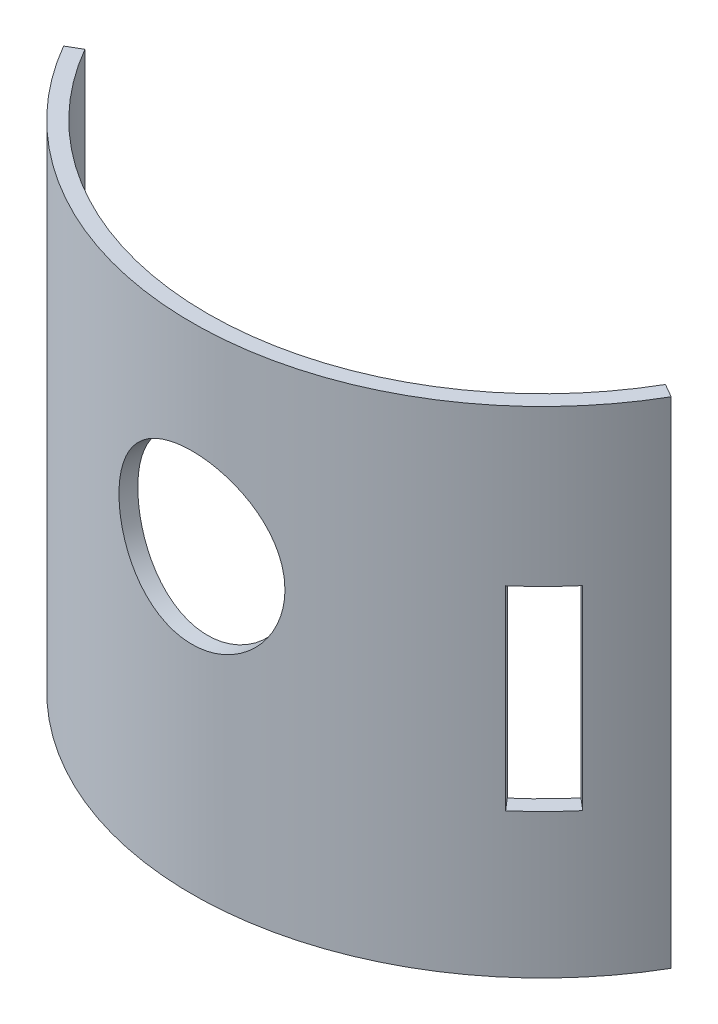
ISO-10303-21;
HEADER;
FILE_DESCRIPTION(('STEP AP214'),'2;1');
FILE_NAME('part.step','',(''),(''),'','','');
FILE_SCHEMA(('AUTOMOTIVE_DESIGN { 1 0 10303 214 1 1 1 1 }'));
ENDSEC;
DATA;
#1=APPLICATION_CONTEXT('core data for automotive mechanical design processes');
#2=APPLICATION_PROTOCOL_DEFINITION('international standard','automotive_design',2000,#1);
#3=PRODUCT_CONTEXT('',#1,'mechanical');
#4=PRODUCT('Part','Part','',(#3));
#5=PRODUCT_RELATED_PRODUCT_CATEGORY('part','',(#4));
#6=PRODUCT_DEFINITION_FORMATION('','',#4);
#7=PRODUCT_DEFINITION_CONTEXT('part definition',#1,'design');
#8=PRODUCT_DEFINITION('design','',#6,#7);
#9=PRODUCT_DEFINITION_SHAPE('','',#8);
#10=(LENGTH_UNIT() NAMED_UNIT(*) SI_UNIT(.MILLI.,.METRE.));
#11=(NAMED_UNIT(*) PLANE_ANGLE_UNIT() SI_UNIT($,.RADIAN.));
#12=(NAMED_UNIT(*) SI_UNIT($,.STERADIAN.) SOLID_ANGLE_UNIT());
#13=UNCERTAINTY_MEASURE_WITH_UNIT(LENGTH_MEASURE(1.E-05),#10,'distance_accuracy_value','');
#14=(GEOMETRIC_REPRESENTATION_CONTEXT(3) GLOBAL_UNCERTAINTY_ASSIGNED_CONTEXT((#13)) GLOBAL_UNIT_ASSIGNED_CONTEXT((#10,
#11,#12)) REPRESENTATION_CONTEXT('',''));
#15=CARTESIAN_POINT('',(0.,0.,0.));
#16=DIRECTION('',(0.,0.,1.));
#17=DIRECTION('',(1.,0.,0.));
#18=AXIS2_PLACEMENT_3D('',#15,#16,#17);
#19=CARTESIAN_POINT('',(10.6480446976216,54.,43.7220670156095));
#20=CARTESIAN_POINT('',(10.6480241848285,55.4117587281219,43.7220720112823));
#21=CARTESIAN_POINT('',(10.3783989338738,56.809592436746,43.7901892794867));
#22=CARTESIAN_POINT('',(9.32415964855563,59.4180564971945,44.0267178927995));
#23=CARTESIAN_POINT('',(8.54929736085108,60.6031774708098,44.1916946679872));
#24=CARTESIAN_POINT('',(6.58135222344387,62.5995612988137,44.5273193208825));
#25=CARTESIAN_POINT('',(5.40681599713528,63.3914917608391,44.6930316966723));
#26=CARTESIAN_POINT('',(2.80945801797008,64.4718994578725,44.9311438437961));
#27=CARTESIAN_POINT('',(1.41158927225343,64.7499899424048,45.0000010762988));
#28=CARTESIAN_POINT('',(-1.41165789399572,64.7500093068338,44.999998923675));
#29=CARTESIAN_POINT('',(-2.80937910920019,64.471929608087,44.9311529401948));
#30=CARTESIAN_POINT('',(-5.40702235529584,63.3914118150017,44.6930109162911));
#31=CARTESIAN_POINT('',(-6.58137182860642,62.5995521977577,44.5273170743156));
#32=CARTESIAN_POINT('',(-8.54937387056449,60.6030904680058,44.1916805225183));
#33=CARTESIAN_POINT('',(-9.32424788183116,59.4178111402769,44.0266984063077));
#34=CARTESIAN_POINT('',(-10.3783597958543,56.8097108109514,43.7901977509763));
#35=CARTESIAN_POINT('',(-10.6479735537284,55.4110884917103,43.7220843419467));
#36=CARTESIAN_POINT('',(-10.6481136690677,52.588774423884,43.7220502183488));
#37=CARTESIAN_POINT('',(-10.3783501463164,51.190290402483,43.7902005361574));
#38=CARTESIAN_POINT('',(-9.32415914860733,48.5819329514156,44.0267176942351));
#39=CARTESIAN_POINT('',(-8.54932136142821,47.3968224378713,44.1916916418545));
#40=CARTESIAN_POINT('',(-6.58123473580066,45.4003403254668,44.5273382907851));
#41=CARTESIAN_POINT('',(-5.4068437060408,44.6084983911633,44.6930309993162));
#42=CARTESIAN_POINT('',(-2.80930419626679,43.5280585950235,44.9311561024222));
#43=CARTESIAN_POINT('',(-1.41152211974122,43.2499941843295,45.00000322452));
#44=CARTESIAN_POINT('',(1.41172771073137,43.2500093913664,44.9999967752452));
#45=CARTESIAN_POINT('',(2.80956445643742,43.5281549409807,44.9311377896082));
#46=CARTESIAN_POINT('',(5.40696302427378,44.6085565150178,44.6930145141024));
#47=CARTESIAN_POINT('',(6.58141145354707,45.4004754033943,44.527311432723));
#48=CARTESIAN_POINT('',(8.54943205109545,47.3969768147632,44.1916694836401));
#49=CARTESIAN_POINT('',(9.32425955984665,48.5821673279446,44.0266961156835));
#50=CARTESIAN_POINT('',(10.3784003802346,51.1904358740578,43.7901883159878));
#51=CARTESIAN_POINT('',(10.6480652104146,52.5882412718781,43.7220620199368));
#52=CARTESIAN_POINT('',(10.6480446976216,54.,43.7220670156095));
#53=CARTESIAN_POINT('',(9.22830540460537,54.,37.8924580801949));
#54=CARTESIAN_POINT('',(9.22828762685141,55.4117587281219,37.892462409778));
#55=CARTESIAN_POINT('',(8.99461240935729,56.809592436746,37.9514973755551));
#56=CARTESIAN_POINT('',(8.08093836208154,59.4180564971945,38.1564888404262));
#57=CARTESIAN_POINT('',(7.40939104607094,60.6031774708098,38.2994687122556));
#58=CARTESIAN_POINT('',(5.70383859365136,62.5995612988137,38.5903434114315));
#59=CARTESIAN_POINT('',(4.68590719751725,63.3914917608391,38.7339608037827));
#60=CARTESIAN_POINT('',(2.43486361557407,64.4718994578725,38.9403246646233));
#61=CARTESIAN_POINT('',(1.2233773692863,64.7499899424048,39.0000009327923));
#62=CARTESIAN_POINT('',(-1.22343684146295,64.7500093068338,38.999999067185));
#63=CARTESIAN_POINT('',(-2.4347952279735,64.471929608087,38.9403325481688));
#64=CARTESIAN_POINT('',(-4.68608604125639,63.3914118150017,38.7339427941189));
#65=CARTESIAN_POINT('',(-5.70385558479223,62.5995521977577,38.5903414644069));
#66=CARTESIAN_POINT('',(-7.40945735448922,60.6030904680058,38.2994564528492));
#67=CARTESIAN_POINT('',(-8.08101483092034,59.4178111402769,38.1564719521334));
#68=CARTESIAN_POINT('',(-8.99457848974043,56.8097108109514,37.9515047175128));
#69=CARTESIAN_POINT('',(-9.22824374656459,55.4110884917103,37.8924730963538));
#70=CARTESIAN_POINT('',(-9.22836517985864,52.588774423884,37.8924435225689));
#71=CARTESIAN_POINT('',(-8.99457012680755,51.190290402483,37.9515071313364));
#72=CARTESIAN_POINT('',(-8.08093792879302,48.5819329514156,38.1564886683371));
#73=CARTESIAN_POINT('',(-7.40941184657111,47.3968224378713,38.2994660896073));
#74=CARTESIAN_POINT('',(-5.70373677102724,45.4003403254668,38.5903598520138));
#75=CARTESIAN_POINT('',(-4.68593121190203,44.6084983911633,38.7339601994074));
#76=CARTESIAN_POINT('',(-2.43473030343122,43.5280585950235,38.9403352887659));
#77=CARTESIAN_POINT('',(-1.22331917044239,43.2499941843295,39.000002794584));
#78=CARTESIAN_POINT('',(1.22349734930052,43.2500093913664,38.9999972052125));
#79=CARTESIAN_POINT('',(2.43495586224576,43.5281549409807,38.9403194176604));
#80=CARTESIAN_POINT('',(4.68603462103728,44.6085565150178,38.7339459122221));
#81=CARTESIAN_POINT('',(5.70388992640746,45.4004754033943,38.5903365750266));
#82=CARTESIAN_POINT('',(7.40950777761606,47.3969768147632,38.2994468858214));
#83=CARTESIAN_POINT('',(8.0810249518671,48.5821673279446,38.1564699669257));
#84=CARTESIAN_POINT('',(8.99461366286998,51.1904358740578,37.9514965405228));
#85=CARTESIAN_POINT('',(9.22832318235933,52.5882412718781,37.8924537506119));
#86=CARTESIAN_POINT('',(9.22830540460537,54.,37.8924580801949));
#87=B_SPLINE_SURFACE_WITH_KNOTS('',1,3,((#19,#20,#21,#22,#23,#24,#25,#26,#27,#28,#29,#30,#31,
#32,#33,#34,#35,#36,#37,#38,#39,#40,#41,#42,#43,#44,#45,#46,#47,#48,#49,#50,#51,#52),(#53,#54,
#55,#56,#57,#58,#59,#60,#61,#62,#63,#64,#65,#66,#67,#68,#69,#70,#71,#72,#73,#74,#75,#76,#77,#78,
#79,#80,#81,#82,#83,#84,#85,#86)),.UNSPECIFIED.,.F.,.T.,.F.,(2,2),(4,2,2,2,2,2,2,2,2,2,2,2,2,2,
2,2,4),(0.,1.),(0.,0.0625,0.125,0.1875,0.25,0.3125,0.375,0.4375,0.5,0.5625,0.625,0.6875,0.75,
0.8125,0.875,0.9375,1.),.UNSPECIFIED.);
#88=CARTESIAN_POINT('',(10.6480446976216,54.,43.7220670156095));
#89=CARTESIAN_POINT('',(10.6480241848285,55.4117587281219,43.7220720112823));
#90=CARTESIAN_POINT('',(10.3783989338738,56.809592436746,43.7901892794867));
#91=CARTESIAN_POINT('',(9.32415964855563,59.4180564971945,44.0267178927995));
#92=CARTESIAN_POINT('',(8.54929736085108,60.6031774708098,44.1916946679872));
#93=CARTESIAN_POINT('',(6.58135222344387,62.5995612988137,44.5273193208825));
#94=CARTESIAN_POINT('',(5.40681599713528,63.3914917608391,44.6930316966723));
#95=CARTESIAN_POINT('',(2.80945801797008,64.4718994578725,44.9311438437961));
#96=CARTESIAN_POINT('',(1.41158927225343,64.7499899424048,45.0000010762988));
#97=CARTESIAN_POINT('',(-1.41165789399572,64.7500093068338,44.999998923675));
#98=CARTESIAN_POINT('',(-2.80937910920019,64.471929608087,44.9311529401948));
#99=CARTESIAN_POINT('',(-5.40702235529584,63.3914118150017,44.6930109162911));
#100=CARTESIAN_POINT('',(-6.58137182860642,62.5995521977577,44.5273170743156));
#101=CARTESIAN_POINT('',(-8.54937387056449,60.6030904680058,44.1916805225183));
#102=CARTESIAN_POINT('',(-9.32424788183116,59.4178111402769,44.0266984063077));
#103=CARTESIAN_POINT('',(-10.3783597958543,56.8097108109514,43.7901977509763));
#104=CARTESIAN_POINT('',(-10.6479735537284,55.4110884917103,43.7220843419467));
#105=CARTESIAN_POINT('',(-10.6481136690677,52.588774423884,43.7220502183488));
#106=CARTESIAN_POINT('',(-10.3783501463164,51.190290402483,43.7902005361574));
#107=CARTESIAN_POINT('',(-9.32415914860733,48.5819329514156,44.0267176942351));
#108=CARTESIAN_POINT('',(-8.54932136142821,47.3968224378713,44.1916916418545));
#109=CARTESIAN_POINT('',(-6.58123473580066,45.4003403254668,44.5273382907851));
#110=CARTESIAN_POINT('',(-5.4068437060408,44.6084983911633,44.6930309993162));
#111=CARTESIAN_POINT('',(-2.80930419626679,43.5280585950235,44.9311561024222));
#112=CARTESIAN_POINT('',(-1.41152211974122,43.2499941843295,45.00000322452));
#113=CARTESIAN_POINT('',(1.41172771073137,43.2500093913664,44.9999967752452));
#114=CARTESIAN_POINT('',(2.80956445643742,43.5281549409807,44.9311377896082));
#115=CARTESIAN_POINT('',(5.40696302427378,44.6085565150178,44.6930145141024));
#116=CARTESIAN_POINT('',(6.58141145354707,45.4004754033943,44.527311432723));
#117=CARTESIAN_POINT('',(8.54943205109545,47.3969768147632,44.1916694836401));
#118=CARTESIAN_POINT('',(9.32425955984665,48.5821673279446,44.0266961156835));
#119=CARTESIAN_POINT('',(10.3784003802346,51.1904358740578,43.7901883159878));
#120=CARTESIAN_POINT('',(10.6480652104146,52.5882412718781,43.7220620199368));
#121=CARTESIAN_POINT('',(10.6480446976216,54.,43.7220670156095));
#122=B_SPLINE_CURVE_WITH_KNOTS('',3,(#88,#89,#90,#91,#92,#93,#94,#95,#96,#97,#98,#99,#100,#101,
#102,#103,#104,#105,#106,#107,#108,#109,#110,#111,#112,#113,#114,#115,#116,#117,#118,#119,#120,
#121),.UNSPECIFIED.,.T.,.F.,(4,2,2,2,2,2,2,2,2,2,2,2,2,2,2,2,4),(0.,0.0625,0.125,0.1875,0.25,
0.3125,0.375,0.4375,0.5,0.5625,0.625,0.6875,0.75,0.8125,0.875,0.9375,1.),.UNSPECIFIED.);
#123=CARTESIAN_POINT('',(10.6480446976216,54.,43.7220670156095));
#124=VERTEX_POINT('',#123);
#125=EDGE_CURVE('E144',#124,#124,#122,.T.);
#126=CARTESIAN_POINT('',(10.1747982666162,54.,41.778864037138));
#127=CARTESIAN_POINT('',(10.1748054185918,53.6849128333034,41.7788593647287));
#128=CARTESIAN_POINT('',(10.1619433418617,53.3699046496561,41.7820002282345));
#129=CARTESIAN_POINT('',(10.110538165542,52.7420184683196,41.794470704425));
#130=CARTESIAN_POINT('',(10.0719908780097,52.4291408264181,41.8038013263413));
#131=CARTESIAN_POINT('',(9.9693233112693,51.807636427703,41.8284037476575));
#132=CARTESIAN_POINT('',(9.90518569765739,51.4990126993122,41.843679574054));
#133=CARTESIAN_POINT('',(9.75158939229445,50.8884535256935,41.8797412416307));
#134=CARTESIAN_POINT('',(9.66213075457317,50.5865180661958,41.9005270710536));
#135=CARTESIAN_POINT('',(9.45836890757227,49.9918960798174,41.9469922285678));
#136=CARTESIAN_POINT('',(9.34409246024245,49.699199976209,41.9726662818601));
#137=CARTESIAN_POINT('',(9.09113294867701,49.1249468878387,42.0281817146118));
#138=CARTESIAN_POINT('',(8.95244943526423,48.843390108197,42.0580231707643));
#139=CARTESIAN_POINT('',(8.65139907590815,48.2936846236046,42.1209796601126));
#140=CARTESIAN_POINT('',(8.48903692388324,48.0255332753517,42.1540940440836));
#141=CARTESIAN_POINT('',(8.14146443219154,47.50479289014,42.2225995665758));
#142=CARTESIAN_POINT('',(7.95625584870554,47.2522026592502,42.2579905299989));
#143=CARTESIAN_POINT('',(7.56972072675183,46.7718212085273,42.3289120363308));
#144=CARTESIAN_POINT('',(7.36901822433676,46.5435229230549,42.3644086978355));
#145=CARTESIAN_POINT('',(6.94820251832617,46.1055710350902,42.4354568103704));
#146=CARTESIAN_POINT('',(6.72808950128664,45.8959172534431,42.4710082608707));
#147=CARTESIAN_POINT('',(6.26992203288417,45.4971240750793,42.541059683426));
#148=CARTESIAN_POINT('',(6.0318714141573,45.3079803170372,42.5755598778977));
#149=CARTESIAN_POINT('',(5.53942452887253,44.9518917479544,42.6424259596127));
#150=CARTESIAN_POINT('',(5.28502902854474,44.7849458974248,42.6747919467615));
#151=CARTESIAN_POINT('',(4.77518570393618,44.4828157455534,42.7347640891778));
#152=CARTESIAN_POINT('',(4.52046134198137,44.3464414329235,42.762529245941));
#153=CARTESIAN_POINT('',(3.99975733163561,44.096354230578,42.8143711054749));
#154=CARTESIAN_POINT('',(3.7337780662025,43.9826405705644,42.8384479336157));
#155=CARTESIAN_POINT('',(3.19260886975936,43.7789356917195,42.8821748127334));
#156=CARTESIAN_POINT('',(2.91742137149,43.6889382621537,42.9018260224815));
#157=CARTESIAN_POINT('',(2.35989607386353,43.5334714294879,42.9361021944935));
#158=CARTESIAN_POINT('',(2.07755850486925,43.4680012372337,42.9507273184685));
#159=CARTESIAN_POINT('',(1.52214106784168,43.3648474031047,42.9739045511039));
#160=CARTESIAN_POINT('',(1.24929799693047,43.3259450465378,42.982722241774));
#161=CARTESIAN_POINT('',(0.701194680861692,43.2712115121405,42.9951561823584));
#162=CARTESIAN_POINT('',(0.42593453317434,43.2553794082461,42.9987726410554));
#163=CARTESIAN_POINT('',(-0.124919243628555,43.2469315315776,43.0007005538205));
#164=CARTESIAN_POINT('',(-0.400512818730062,43.2543123999648,42.9990127753937));
#165=CARTESIAN_POINT('',(-0.950021219797659,43.2922118828171,42.9903822556844));
#166=CARTESIAN_POINT('',(-1.22393605081035,43.3227304276916,42.9834395302071));
#167=CARTESIAN_POINT('',(-1.76203992639223,43.4056991486603,42.964707530243));
#168=CARTESIAN_POINT('',(-2.02631010206385,43.4576494759201,42.9530288116609));
#169=CARTESIAN_POINT('',(-2.5494703936739,43.5829696924086,42.9251537078521));
#170=CARTESIAN_POINT('',(-2.80836062411603,43.656339125264,42.908957418881));
#171=CARTESIAN_POINT('',(-3.31901486098507,43.8238968380747,42.8724815388836));
#172=CARTESIAN_POINT('',(-3.57077881926904,43.9180852586391,42.8522019202792));
#173=CARTESIAN_POINT('',(-4.06553299770279,44.1265303324856,42.8080965956304));
#174=CARTESIAN_POINT('',(-4.30852307668112,44.240787308497,42.7842708325603));
#175=CARTESIAN_POINT('',(-4.78783035282051,44.4903530644821,42.7333084582595));
#176=CARTESIAN_POINT('',(-5.0239896224762,44.6259558828578,42.706126960791));
#177=CARTESIAN_POINT('',(-5.48425604448364,44.9158353361964,42.6494632076536));
#178=CARTESIAN_POINT('',(-5.70836309191332,45.07011213369,42.6199809319603));
#179=CARTESIAN_POINT('',(-6.1432550107171,45.3961818886712,42.5594716863311));
#180=CARTESIAN_POINT('',(-6.35403855902374,45.567976581331,42.5284445635318));
#181=CARTESIAN_POINT('',(-6.76112327531247,45.9278284098042,42.4656289361312));
#182=CARTESIAN_POINT('',(-6.95742350413614,46.1158865984955,42.4338403823323));
#183=CARTESIAN_POINT('',(-7.34277949252729,46.5155155256777,42.3688969860755));
#184=CARTESIAN_POINT('',(-7.53114199430681,46.7277551509643,42.3357432474691));
#185=CARTESIAN_POINT('',(-7.89002319330529,47.16694419329,42.2703302003564));
#186=CARTESIAN_POINT('',(-8.06054135174808,47.393894054142,42.2380709188782));
#187=CARTESIAN_POINT('',(-8.38296365134965,47.8609277806965,42.1752641841547));
#188=CARTESIAN_POINT('',(-8.53486456966233,48.1010139100539,42.1447170277921));
#189=CARTESIAN_POINT('',(-8.81936073311629,48.5926561719196,42.0861019409665));
#190=CARTESIAN_POINT('',(-8.951955140729,48.8442128014041,42.0580341180793));
#191=CARTESIAN_POINT('',(-9.20362207084958,49.3704047830086,42.0036995038327));
#192=CARTESIAN_POINT('',(-9.32164260833268,49.6455610833973,41.9776005878008));
#193=CARTESIAN_POINT('',(-9.53521326772755,50.2048158585292,41.92960402822));
#194=CARTESIAN_POINT('',(-9.63076260978946,50.4889146432283,41.9077065304836));
#195=CARTESIAN_POINT('',(-9.79905537438931,51.0641560918772,41.8686754223292));
#196=CARTESIAN_POINT('',(-9.87179503272965,51.3552999099125,41.8515425982604));
#197=CARTESIAN_POINT('',(-9.99418797113008,51.9426580617173,41.822483952994));
#198=CARTESIAN_POINT('',(-10.0438406009739,52.2388725380519,41.8105582784497));
#199=CARTESIAN_POINT('',(-10.1213499431193,52.8459750644347,41.7918644946735));
#200=CARTESIAN_POINT('',(-10.1482888713298,53.1569873707734,41.7853138246964));
#201=CARTESIAN_POINT('',(-10.1769269833088,53.7802443342984,41.7783481371211));
#202=CARTESIAN_POINT('',(-10.1786255377259,54.0924890220191,41.7779332725151));
#203=CARTESIAN_POINT('',(-10.1567993478391,54.7160831521734,41.7832448829147));
#204=CARTESIAN_POINT('',(-10.133271438679,55.0274324773624,41.7889721284957));
#205=CARTESIAN_POINT('',(-10.0610982781546,55.6470311100908,41.806407120322));
#206=CARTESIAN_POINT('',(-10.0124535359907,55.9552804803472,41.8181147453252));
#207=CARTESIAN_POINT('',(-9.88944822166747,56.5704294042859,41.8473757932298));
#208=CARTESIAN_POINT('',(-9.81476760332001,56.8772616089774,41.865001864323));
#209=CARTESIAN_POINT('',(-9.640107403666,57.4832867059377,41.9055647952399));
#210=CARTESIAN_POINT('',(-9.5401276838748,57.7824795563797,41.9285016841344));
#211=CARTESIAN_POINT('',(-9.31526953061107,58.3709549144106,41.9790307303288));
#212=CARTESIAN_POINT('',(-9.19039136889582,58.6602375301257,42.0066228368182));
#213=CARTESIAN_POINT('',(-8.91634826174794,59.2266585460268,42.0656435769621));
#214=CARTESIAN_POINT('',(-8.76718359353988,59.5037970847886,42.097072166823));
#215=CARTESIAN_POINT('',(-8.44816795021051,60.0389369249248,42.1622399603645));
#216=CARTESIAN_POINT('',(-8.27872851027085,60.297189646964,42.195928597098));
#217=CARTESIAN_POINT('',(-7.91803042204849,60.7977289761416,42.2650979187127));
#218=CARTESIAN_POINT('',(-7.72677241308781,61.040016050773,42.3005785510685));
#219=CARTESIAN_POINT('',(-7.32353676768054,61.5065182932152,42.3722517640322));
#220=CARTESIAN_POINT('',(-7.11156248529326,61.730736375788,42.4084442286359));
#221=CARTESIAN_POINT('',(-6.66819811832284,62.1591561150019,42.4804136840076));
#222=CARTESIAN_POINT('',(-6.43680874466864,62.3633585039711,42.516190689934));
#223=CARTESIAN_POINT('',(-5.96686756039214,62.7413013780827,42.5846255866095));
#224=CARTESIAN_POINT('',(-5.72908903096069,62.9159914222586,42.6173514385222));
#225=CARTESIAN_POINT('',(-5.23883806580552,63.2438436885975,42.6803893006831));
#226=CARTESIAN_POINT('',(-4.98636691142271,63.3970077840677,42.7107015208792));
#227=CARTESIAN_POINT('',(-4.46855959071781,63.6803719202732,42.7679763166302));
#228=CARTESIAN_POINT('',(-4.20322652571339,63.8105774621008,42.7949396941414));
#229=CARTESIAN_POINT('',(-3.66163296280789,64.0468239953752,42.8446772201675));
#230=CARTESIAN_POINT('',(-3.38537292683802,64.1528660070424,42.8674515455427));
#231=CARTESIAN_POINT('',(-2.83916739417114,64.3347535319849,42.9069929242962));
#232=CARTESIAN_POINT('',(-2.56967738745632,64.4119131374214,42.9240165783132));
#233=CARTESIAN_POINT('',(-2.02484485811694,64.5429915494471,42.9531652882118));
#234=CARTESIAN_POINT('',(-1.74950255275074,64.5969112172105,42.965290525607));
#235=CARTESIAN_POINT('',(-1.19509051196771,64.6810084087633,42.9842840613939));
#236=CARTESIAN_POINT('',(-0.91602151450765,64.7111905641669,42.9911533853015));
#237=CARTESIAN_POINT('',(-0.356244177117473,64.7475447353541,42.9994352858449));
#238=CARTESIAN_POINT('',(-0.0755358690706945,64.7537172165602,43.0008479682566));
#239=CARTESIAN_POINT('',(0.475405998446964,64.7422069244042,42.9982229654669));
#240=CARTESIAN_POINT('',(0.745658369933057,64.7253614438155,42.9943765790469));
#241=CARTESIAN_POINT('',(1.28372706198721,64.669433935208,42.9816758702769));
#242=CARTESIAN_POINT('',(1.55154344698559,64.6303524970641,42.9728216807738));
#243=CARTESIAN_POINT('',(2.08283231947681,64.5302955709011,42.9503493081255));
#244=CARTESIAN_POINT('',(2.34630504100185,64.4693212665063,42.9367313825297));
#245=CARTESIAN_POINT('',(2.8670963405522,64.3259895034515,42.9051025100137));
#246=CARTESIAN_POINT('',(3.1244148714493,64.2436318810973,42.8870915294638));
#247=CARTESIAN_POINT('',(3.63132755720763,64.0581427453492,42.8471486798985));
#248=CARTESIAN_POINT('',(3.88091647643791,63.9549974918382,42.8252142186423));
#249=CARTESIAN_POINT('',(4.37056528627414,63.7287937659576,42.7780161451721));
#250=CARTESIAN_POINT('',(4.61062521682363,63.6057353770707,42.7527525469152));
#251=CARTESIAN_POINT('',(5.07974826873015,63.3406825693151,42.6995538099721));
#252=CARTESIAN_POINT('',(5.30881093560587,63.1986873687639,42.6716185610178));
#253=CARTESIAN_POINT('',(5.75460282944491,62.8968459417465,42.613789779854));
#254=CARTESIAN_POINT('',(5.97133134190851,62.7369986827221,42.5838961344128));
#255=CARTESIAN_POINT('',(6.39843498784245,62.3948697323635,42.5218553399126));
#256=CARTESIAN_POINT('',(6.60833913384636,62.2120076344958,42.4896660837901));
#257=CARTESIAN_POINT('',(7.01248608688379,61.8298076777114,42.4248386860582));
#258=CARTESIAN_POINT('',(7.20672865635912,61.6304695689759,42.3922005376487));
#259=CARTESIAN_POINT('',(7.57856482537211,61.2167430116471,42.3273078217687));
#260=CARTESIAN_POINT('',(7.75615685180278,61.0023531443362,42.2950532907924));
#261=CARTESIAN_POINT('',(8.0939113065899,60.5599600163117,42.2317196239927));
#262=CARTESIAN_POINT('',(8.25406621898009,60.3319509503379,42.2006409987594));
#263=CARTESIAN_POINT('',(8.56391139842577,59.8519227067715,42.1388852776279));
#264=CARTESIAN_POINT('',(8.71264410231307,59.599271877028,42.1083104692254));
#265=CARTESIAN_POINT('',(8.98925147617657,59.0826065513066,42.0501287566221));
#266=CARTESIAN_POINT('',(9.11713372983396,58.8185962313353,42.0225207745846));
#267=CARTESIAN_POINT('',(9.3515348782146,58.2809602213567,41.9709806397406));
#268=CARTESIAN_POINT('',(9.45805762811837,58.0073362770105,41.9470478237858));
#269=CARTESIAN_POINT('',(9.64934712045112,57.4523380061469,41.9034565502909));
#270=CARTESIAN_POINT('',(9.73411621676126,57.1709645218296,41.8837976303239));
#271=CARTESIAN_POINT('',(9.9297566157867,56.4165112850909,41.8379727186923));
#272=CARTESIAN_POINT('',(10.0215854030603,55.9381049033252,41.8159269722466));
#273=CARTESIAN_POINT('',(10.1441035334734,54.9730701019144,41.7863755661637));
#274=CARTESIAN_POINT('',(10.1747872251838,54.4864409264568,41.7788712505423));
#275=CARTESIAN_POINT('',(10.1747982666162,54.,41.778864037138));
#276=B_SPLINE_CURVE_WITH_KNOTS('',3,(#126,#127,#128,#129,#130,#131,#132,#133,#134,#135,#136,
#137,#138,#139,#140,#141,#142,#143,#144,#145,#146,#147,#148,#149,#150,#151,#152,#153,#154,#155,
#156,#157,#158,#159,#160,#161,#162,#163,#164,#165,#166,#167,#168,#169,#170,#171,#172,#173,#174,
#175,#176,#177,#178,#179,#180,#181,#182,#183,#184,#185,#186,#187,#188,#189,#190,#191,#192,#193,
#194,#195,#196,#197,#198,#199,#200,#201,#202,#203,#204,#205,#206,#207,#208,#209,#210,#211,#212,
#213,#214,#215,#216,#217,#218,#219,#220,#221,#222,#223,#224,#225,#226,#227,#228,#229,#230,#231,
#232,#233,#234,#235,#236,#237,#238,#239,#240,#241,#242,#243,#244,#245,#246,#247,#248,#249,#250,
#251,#252,#253,#254,#255,#256,#257,#258,#259,#260,#261,#262,#263,#264,#265,#266,#267,#268,#269,
#270,#271,#272,#273,#274,#275),.UNSPECIFIED.,.T.,.F.,(4,2,2,2,2,2,2,2,2,2,2,2,2,2,2,2,2,2,2,2,2,
2,2,2,2,2,2,2,2,2,2,2,2,2,2,2,2,2,2,2,2,2,2,2,2,2,2,2,2,2,2,2,2,2,2,2,2,2,2,2,2,2,2,2,2,2,2,2,2,
2,2,2,2,2,4),(0.,0.944846327054281,1.88984674787055,2.83548838385507,3.78112800205417,
4.7257529214389,5.67039522711279,6.61485052617732,7.55923327115884,8.47619886399112,
9.39315564475472,10.3099170565635,11.2266355229163,12.0963267366413,12.9659883821273,
13.8354220564254,14.704827754632,15.531046851596,16.3572327823534,17.1832991723037,
18.0093630777305,18.8171619504218,19.6249436127339,20.4327307308725,21.2405308404951,
22.0606301446415,22.8807365871058,23.7009243413185,24.5211652332445,25.3773111868144,
26.2334829826371,27.0898027823637,27.9461597187206,28.8467429153652,29.7473573616194,
30.6481203548181,31.5489087153032,32.4845546985808,33.4202240115135,34.3560107251756,
35.2917784681176,36.239480200109,37.1871871198334,38.1348836962542,39.0825694557075,
40.0135302517454,40.9444637760165,41.8752468268074,42.8059958096634,43.6954491969356,
44.5848251310607,45.4739876716375,46.3631126634864,47.2045704353024,48.0459970235543,
48.8872593936338,49.7285054559384,50.5399515829294,51.3513761849021,52.1627569243087,
52.9741438752026,53.7860689024374,54.5979905258914,55.4099456746043,56.2219478109279,
57.0617283781712,57.9015216809937,58.7413942458726,59.5816274019531,60.4649410473708,
61.3479326956556,62.230764828886,63.113501393849,64.5720484145655,66.0307302374728),.UNSPECIFIED.);
#277=CARTESIAN_POINT('',(10.1747982666162,54.,41.778864037138));
#278=VERTEX_POINT('',#277);
#279=EDGE_CURVE('E184',#278,#278,#276,.T.);
#280=ORIENTED_EDGE('',*,*,#125,.T.);
#281=EDGE_LOOP('',(#280));
#282=FACE_BOUND('',#281,.T.);
#283=ORIENTED_EDGE('',*,*,#279,.T.);
#284=EDGE_LOOP('',(#283));
#285=FACE_BOUND('',#284,.T.);
#286=ADVANCED_FACE('F72',(#282,#285),#87,.F.);
#287=CARTESIAN_POINT('',(0.,15.5,0.));
#288=DIRECTION('',(0.,1.,0.));
#289=DIRECTION('',(0.,0.,1.));
#290=AXIS2_PLACEMENT_3D('',#287,#288,#289);
#291=CYLINDRICAL_SURFACE('',#290,45.);
#292=DIRECTION('',(0.,-1.,0.));
#293=VECTOR('',#292,1.);
#294=CARTESIAN_POINT('',(29.3485506319874,59.,34.1124988208379));
#295=LINE('',#294,#293);
#296=CARTESIAN_POINT('',(29.3485506319874,59.,34.112498820838));
#297=VERTEX_POINT('',#296);
#298=CARTESIAN_POINT('',(29.3485506319874,34.,34.1124988208379));
#299=VERTEX_POINT('',#298);
#300=EDGE_CURVE('E140',#297,#299,#295,.T.);
#301=ORIENTED_EDGE('',*,*,#300,.F.);
#302=CARTESIAN_POINT('',(0.,59.,0.));
#303=DIRECTION('',(0.,1.,0.));
#304=DIRECTION('',(0.76175998141629,0.,0.647859344852456));
#305=AXIS2_PLACEMENT_3D('',#302,#303,#304);
#306=CIRCLE('',#305,45.);
#307=CARTESIAN_POINT('',(34.279199163733,59.,29.1536705183605));
#308=VERTEX_POINT('',#307);
#309=EDGE_CURVE('E148',#297,#308,#306,.T.);
#310=ORIENTED_EDGE('',*,*,#309,.T.);
#311=DIRECTION('',(0.,1.,0.));
#312=VECTOR('',#311,1.);
#313=CARTESIAN_POINT('',(34.279199163733,34.,29.1536705183605));
#314=LINE('',#313,#312);
#315=CARTESIAN_POINT('',(34.279199163733,34.,29.1536705183605));
#316=VERTEX_POINT('',#315);
#317=EDGE_CURVE('E88',#316,#308,#314,.T.);
#318=ORIENTED_EDGE('',*,*,#317,.F.);
#319=CARTESIAN_POINT('',(0.,34.,0.));
#320=DIRECTION('',(0.,1.,0.));
#321=DIRECTION('',(0.76175998141629,0.,0.647859344852456));
#322=AXIS2_PLACEMENT_3D('',#319,#320,#321);
#323=CIRCLE('',#322,45.);
#324=EDGE_CURVE('E157',#299,#316,#323,.T.);
#325=ORIENTED_EDGE('',*,*,#324,.F.);
#326=EDGE_LOOP('',(#301,#310,#318,#325));
#327=FACE_BOUND('',#326,.T.);
#328=CARTESIAN_POINT('',(0.,15.5,0.));
#329=DIRECTION('',(0.,-1.,0.));
#330=DIRECTION('',(0.,0.,-1.));
#331=AXIS2_PLACEMENT_3D('',#328,#329,#330);
#332=CIRCLE('',#331,45.);
#333=CARTESIAN_POINT('',(-38.9711431702998,15.5,22.4999999999999));
#334=VERTEX_POINT('',#333);
#335=CARTESIAN_POINT('',(38.9711431702998,15.5,22.4999999999999));
#336=VERTEX_POINT('',#335);
#337=EDGE_CURVE('E289',#334,#336,#332,.F.);
#338=ORIENTED_EDGE('',*,*,#337,.T.);
#339=DIRECTION('',(0.,-1.,0.));
#340=VECTOR('',#339,1.);
#341=CARTESIAN_POINT('',(38.9711431702998,2.,22.4999999999999));
#342=LINE('',#341,#340);
#343=CARTESIAN_POINT('',(38.9711431702998,79.,22.4999999999999));
#344=VERTEX_POINT('',#343);
#345=EDGE_CURVE('E256',#336,#344,#342,.F.);
#346=ORIENTED_EDGE('',*,*,#345,.T.);
#347=CARTESIAN_POINT('',(0.,79.,0.));
#348=DIRECTION('',(0.,1.,0.));
#349=DIRECTION('',(0.,0.,1.));
#350=AXIS2_PLACEMENT_3D('',#347,#348,#349);
#351=CIRCLE('',#350,45.);
#352=CARTESIAN_POINT('',(-38.9711431702998,79.,22.4999999999999));
#353=VERTEX_POINT('',#352);
#354=EDGE_CURVE('E263',#344,#353,#351,.F.);
#355=ORIENTED_EDGE('',*,*,#354,.T.);
#356=DIRECTION('',(0.,-1.,0.));
#357=VECTOR('',#356,1.);
#358=CARTESIAN_POINT('',(-38.9711431702998,2.,22.4999999999999));
#359=LINE('',#358,#357);
#360=EDGE_CURVE('E280',#334,#353,#359,.F.);
#361=ORIENTED_EDGE('',*,*,#360,.F.);
#362=EDGE_LOOP('',(#338,#346,#355,#361));
#363=FACE_BOUND('',#362,.T.);
#364=ORIENTED_EDGE('',*,*,#125,.F.);
#365=EDGE_LOOP('',(#364));
#366=FACE_BOUND('',#365,.T.);
#367=ADVANCED_FACE('F154',(#327,#363,#366),#291,.T.);
#368=CARTESIAN_POINT('',(0.,15.5,0.));
#369=DIRECTION('',(0.,1.,0.));
#370=DIRECTION('',(0.,0.,1.));
#371=AXIS2_PLACEMENT_3D('',#368,#369,#370);
#372=CYLINDRICAL_SURFACE('',#371,43.);
#373=DIRECTION('',(0.,1.,0.));
#374=VECTOR('',#373,1.);
#375=CARTESIAN_POINT('',(28.0441706038991,15.5,32.596387762134));
#376=LINE('',#375,#374);
#377=CARTESIAN_POINT('',(28.0441706038991,34.,32.596387762134));
#378=VERTEX_POINT('',#377);
#379=CARTESIAN_POINT('',(28.0441706038991,59.,32.5963877621341));
#380=VERTEX_POINT('',#379);
#381=EDGE_CURVE('E12',#378,#380,#376,.T.);
#382=ORIENTED_EDGE('',*,*,#381,.F.);
#383=CARTESIAN_POINT('',(0.,34.,0.));
#384=DIRECTION('',(0.,-1.,0.));
#385=DIRECTION('',(0.,0.,-1.));
#386=AXIS2_PLACEMENT_3D('',#383,#384,#385);
#387=CIRCLE('',#386,43.);
#388=CARTESIAN_POINT('',(32.7556792009005,34.,27.8579518286556));
#389=VERTEX_POINT('',#388);
#390=EDGE_CURVE('E81',#389,#378,#387,.T.);
#391=ORIENTED_EDGE('',*,*,#390,.F.);
#392=DIRECTION('',(0.,1.,0.));
#393=VECTOR('',#392,1.);
#394=CARTESIAN_POINT('',(32.7556792009005,15.5,27.8579518286556));
#395=LINE('',#394,#393);
#396=CARTESIAN_POINT('',(32.7556792009005,59.,27.8579518286556));
#397=VERTEX_POINT('',#396);
#398=EDGE_CURVE('E314',#397,#389,#395,.F.);
#399=ORIENTED_EDGE('',*,*,#398,.F.);
#400=CARTESIAN_POINT('',(0.,59.,0.));
#401=DIRECTION('',(0.,-1.,0.));
#402=DIRECTION('',(0.,0.,-1.));
#403=AXIS2_PLACEMENT_3D('',#400,#401,#402);
#404=CIRCLE('',#403,43.);
#405=EDGE_CURVE('E189',#380,#397,#404,.F.);
#406=ORIENTED_EDGE('',*,*,#405,.F.);
#407=EDGE_LOOP('',(#382,#391,#399,#406));
#408=FACE_BOUND('',#407,.T.);
#409=ORIENTED_EDGE('',*,*,#279,.F.);
#410=EDGE_LOOP('',(#409));
#411=FACE_BOUND('',#410,.T.);
#412=CARTESIAN_POINT('',(0.,79.,0.));
#413=DIRECTION('',(0.,1.,0.));
#414=DIRECTION('',(-0.86602540378444,0.,0.499999999999998));
#415=AXIS2_PLACEMENT_3D('',#412,#413,#414);
#416=CIRCLE('',#415,43.);
#417=CARTESIAN_POINT('',(-37.2390923627309,79.,21.4999999999999));
#418=VERTEX_POINT('',#417);
#419=CARTESIAN_POINT('',(37.2390923627309,79.,21.4999999999999));
#420=VERTEX_POINT('',#419);
#421=EDGE_CURVE('E248',#418,#420,#416,.T.);
#422=ORIENTED_EDGE('',*,*,#421,.T.);
#423=DIRECTION('',(0.,1.,0.));
#424=VECTOR('',#423,1.);
#425=CARTESIAN_POINT('',(37.2390923627309,14.,21.4999999999999));
#426=LINE('',#425,#424);
#427=CARTESIAN_POINT('',(37.2390923627309,15.5,21.4999999999999));
#428=VERTEX_POINT('',#427);
#429=EDGE_CURVE('E251',#428,#420,#426,.T.);
#430=ORIENTED_EDGE('',*,*,#429,.F.);
#431=CARTESIAN_POINT('',(0.,15.5,0.));
#432=DIRECTION('',(0.,-1.,0.));
#433=DIRECTION('',(0.,0.,-1.));
#434=AXIS2_PLACEMENT_3D('',#431,#432,#433);
#435=CIRCLE('',#434,43.);
#436=CARTESIAN_POINT('',(-37.2390923627309,15.5,21.4999999999999));
#437=VERTEX_POINT('',#436);
#438=EDGE_CURVE('E287',#437,#428,#435,.F.);
#439=ORIENTED_EDGE('',*,*,#438,.F.);
#440=DIRECTION('',(0.,1.,0.));
#441=VECTOR('',#440,1.);
#442=CARTESIAN_POINT('',(-37.2390923627309,14.,21.4999999999999));
#443=LINE('',#442,#441);
#444=EDGE_CURVE('E253',#437,#418,#443,.T.);
#445=ORIENTED_EDGE('',*,*,#444,.T.);
#446=EDGE_LOOP('',(#422,#430,#439,#445));
#447=FACE_BOUND('',#446,.T.);
#448=ADVANCED_FACE('F74',(#408,#411,#447),#372,.F.);
#449=CARTESIAN_POINT('',(0.,0.,0.));
#450=DIRECTION('',(0.499999999999998,0.,0.86602540378444));
#451=DIRECTION('',(0.86602540378444,0.,-0.499999999999998));
#452=AXIS2_PLACEMENT_3D('',#449,#450,#451);
#453=PLANE('',#452);
#454=DIRECTION('',(0.86602540378444,0.,-0.499999999999998));
#455=VECTOR('',#454,1.);
#456=CARTESIAN_POINT('',(-41.5692193816531,15.5,23.9999999999999));
#457=LINE('',#456,#455);
#458=EDGE_CURVE('E265',#334,#437,#457,.T.);
#459=ORIENTED_EDGE('',*,*,#458,.F.);
#460=ORIENTED_EDGE('',*,*,#360,.T.);
#461=DIRECTION('',(-0.86602540378444,0.,0.499999999999998));
#462=VECTOR('',#461,1.);
#463=CARTESIAN_POINT('',(-41.5692193816531,79.,23.9999999999999));
#464=LINE('',#463,#462);
#465=EDGE_CURVE('E274',#418,#353,#464,.T.);
#466=ORIENTED_EDGE('',*,*,#465,.F.);
#467=ORIENTED_EDGE('',*,*,#444,.F.);
#468=EDGE_LOOP('',(#459,#460,#466,#467));
#469=FACE_BOUND('',#468,.T.);
#470=ADVANCED_FACE('F211',(#469),#453,.F.);
#471=CARTESIAN_POINT('',(-41.5692193816531,15.5,23.9999999999999));
#472=DIRECTION('',(0.,-1.,0.));
#473=DIRECTION('',(0.,0.,-1.));
#474=AXIS2_PLACEMENT_3D('',#471,#472,#473);
#475=PLANE('',#474);
#476=ORIENTED_EDGE('',*,*,#337,.F.);
#477=ORIENTED_EDGE('',*,*,#458,.T.);
#478=ORIENTED_EDGE('',*,*,#438,.T.);
#479=DIRECTION('',(-0.86602540378444,0.,-0.499999999999998));
#480=VECTOR('',#479,1.);
#481=CARTESIAN_POINT('',(41.5692193816531,15.5,23.9999999999999));
#482=LINE('',#481,#480);
#483=EDGE_CURVE('E257',#336,#428,#482,.T.);
#484=ORIENTED_EDGE('',*,*,#483,.F.);
#485=EDGE_LOOP('',(#476,#477,#478,#484));
#486=FACE_BOUND('',#485,.T.);
#487=ADVANCED_FACE('F201',(#486),#475,.T.);
#488=CARTESIAN_POINT('',(0.,0.,0.));
#489=DIRECTION('',(0.499999999999998,0.,-0.86602540378444));
#490=DIRECTION('',(-0.86602540378444,0.,-0.499999999999998));
#491=AXIS2_PLACEMENT_3D('',#488,#489,#490);
#492=PLANE('',#491);
#493=ORIENTED_EDGE('',*,*,#345,.F.);
#494=ORIENTED_EDGE('',*,*,#483,.T.);
#495=ORIENTED_EDGE('',*,*,#429,.T.);
#496=DIRECTION('',(0.86602540378444,0.,0.499999999999998));
#497=VECTOR('',#496,1.);
#498=CARTESIAN_POINT('',(41.5692193816531,79.,23.9999999999999));
#499=LINE('',#498,#497);
#500=EDGE_CURVE('E261',#420,#344,#499,.T.);
#501=ORIENTED_EDGE('',*,*,#500,.T.);
#502=EDGE_LOOP('',(#493,#494,#495,#501));
#503=FACE_BOUND('',#502,.T.);
#504=ADVANCED_FACE('F210',(#503),#492,.T.);
#505=CARTESIAN_POINT('',(0.,79.,0.));
#506=DIRECTION('',(0.,1.,0.));
#507=DIRECTION('',(0.,0.,1.));
#508=AXIS2_PLACEMENT_3D('',#505,#506,#507);
#509=PLANE('',#508);
#510=ORIENTED_EDGE('',*,*,#465,.T.);
#511=ORIENTED_EDGE('',*,*,#354,.F.);
#512=ORIENTED_EDGE('',*,*,#500,.F.);
#513=ORIENTED_EDGE('',*,*,#421,.F.);
#514=EDGE_LOOP('',(#510,#511,#512,#513));
#515=FACE_BOUND('',#514,.T.);
#516=ADVANCED_FACE('F218',(#515),#509,.T.);
#517=CARTESIAN_POINT('',(29.3485506319874,46.5,34.1124988208379));
#518=DIRECTION('',(-0.758055529351955,0.,0.652190014044165));
#519=DIRECTION('',(0.,-1.,0.));
#520=AXIS2_PLACEMENT_3D('',#517,#518,#519);
#521=PLANE('',#520);
#522=ORIENTED_EDGE('',*,*,#381,.T.);
#523=DIRECTION('',(0.652190014044165,0.,0.758055529351955));
#524=VECTOR('',#523,1.);
#525=CARTESIAN_POINT('',(29.3485506319874,59.,34.112498820838));
#526=LINE('',#525,#524);
#527=EDGE_CURVE('E96',#380,#297,#526,.T.);
#528=ORIENTED_EDGE('',*,*,#527,.T.);
#529=ORIENTED_EDGE('',*,*,#300,.T.);
#530=DIRECTION('',(0.652190014044165,0.,0.758055529351955));
#531=VECTOR('',#530,1.);
#532=CARTESIAN_POINT('',(29.3485506319874,34.,34.1124988208379));
#533=LINE('',#532,#531);
#534=EDGE_CURVE('E145',#378,#299,#533,.T.);
#535=ORIENTED_EDGE('',*,*,#534,.F.);
#536=EDGE_LOOP('',(#522,#528,#529,#535));
#537=FACE_BOUND('',#536,.T.);
#538=ADVANCED_FACE('F137',(#537),#521,.F.);
#539=CARTESIAN_POINT('',(0.,34.,0.));
#540=DIRECTION('',(0.,-1.,0.));
#541=DIRECTION('',(0.,0.,-1.));
#542=AXIS2_PLACEMENT_3D('',#539,#540,#541);
#543=PLANE('',#542);
#544=ORIENTED_EDGE('',*,*,#390,.T.);
#545=ORIENTED_EDGE('',*,*,#534,.T.);
#546=ORIENTED_EDGE('',*,*,#324,.T.);
#547=DIRECTION('',(0.76175998141629,0.,0.647859344852456));
#548=VECTOR('',#547,1.);
#549=CARTESIAN_POINT('',(34.279199163733,34.,29.1536705183605));
#550=LINE('',#549,#548);
#551=EDGE_CURVE('E167',#389,#316,#550,.T.);
#552=ORIENTED_EDGE('',*,*,#551,.F.);
#553=EDGE_LOOP('',(#544,#545,#546,#552));
#554=FACE_BOUND('',#553,.T.);
#555=ADVANCED_FACE('F230',(#554),#543,.F.);
#556=CARTESIAN_POINT('',(34.279199163733,46.5,29.1536705183605));
#557=DIRECTION('',(0.647859344852456,0.,-0.76175998141629));
#558=DIRECTION('',(0.,1.,0.));
#559=AXIS2_PLACEMENT_3D('',#556,#557,#558);
#560=PLANE('',#559);
#561=ORIENTED_EDGE('',*,*,#398,.T.);
#562=ORIENTED_EDGE('',*,*,#551,.T.);
#563=ORIENTED_EDGE('',*,*,#317,.T.);
#564=DIRECTION('',(0.76175998141629,0.,0.647859344852456));
#565=VECTOR('',#564,1.);
#566=CARTESIAN_POINT('',(34.279199163733,59.,29.1536705183605));
#567=LINE('',#566,#565);
#568=EDGE_CURVE('E150',#397,#308,#567,.T.);
#569=ORIENTED_EDGE('',*,*,#568,.F.);
#570=EDGE_LOOP('',(#561,#562,#563,#569));
#571=FACE_BOUND('',#570,.T.);
#572=ADVANCED_FACE('F227',(#571),#560,.F.);
#573=CARTESIAN_POINT('',(0.,59.,0.));
#574=DIRECTION('',(0.,-1.,0.));
#575=DIRECTION('',(0.,0.,-1.));
#576=AXIS2_PLACEMENT_3D('',#573,#574,#575);
#577=PLANE('',#576);
#578=ORIENTED_EDGE('',*,*,#405,.T.);
#579=ORIENTED_EDGE('',*,*,#568,.T.);
#580=ORIENTED_EDGE('',*,*,#309,.F.);
#581=ORIENTED_EDGE('',*,*,#527,.F.);
#582=EDGE_LOOP('',(#578,#579,#580,#581));
#583=FACE_BOUND('',#582,.T.);
#584=ADVANCED_FACE('F149',(#583),#577,.T.);
#585=CLOSED_SHELL('',(#286,#367,#448,#470,#487,#504,#516,#538,#555,#572,#584));
#586=MANIFOLD_SOLID_BREP('B2',#585);
#587=ADVANCED_BREP_SHAPE_REPRESENTATION('',(#18,#586),#14);
#588=SHAPE_DEFINITION_REPRESENTATION(#9,#587);
ENDSEC;
END-ISO-10303-21;
